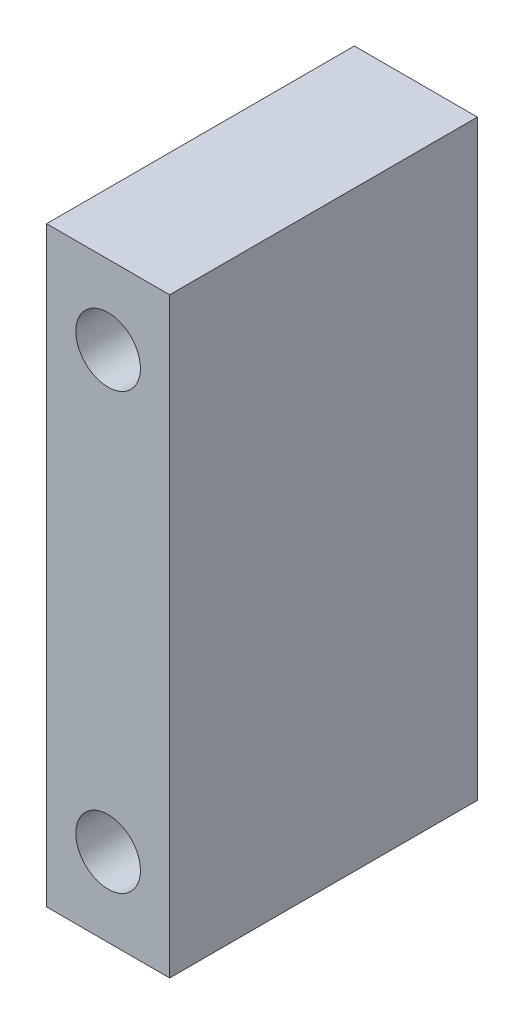
ISO-10303-21;
HEADER;
FILE_DESCRIPTION(('STEP AP214'),'2;1');
FILE_NAME('part.step','',(''),(''),'','','');
FILE_SCHEMA(('AUTOMOTIVE_DESIGN { 1 0 10303 214 1 1 1 1 }'));
ENDSEC;
DATA;
#1=APPLICATION_CONTEXT('core data for automotive mechanical design processes');
#2=APPLICATION_PROTOCOL_DEFINITION('international standard','automotive_design',2000,#1);
#3=PRODUCT_CONTEXT('',#1,'mechanical');
#4=PRODUCT('Part','Part','',(#3));
#5=PRODUCT_RELATED_PRODUCT_CATEGORY('part','',(#4));
#6=PRODUCT_DEFINITION_FORMATION('','',#4);
#7=PRODUCT_DEFINITION_CONTEXT('part definition',#1,'design');
#8=PRODUCT_DEFINITION('design','',#6,#7);
#9=PRODUCT_DEFINITION_SHAPE('','',#8);
#10=(LENGTH_UNIT() NAMED_UNIT(*) SI_UNIT(.MILLI.,.METRE.));
#11=(NAMED_UNIT(*) PLANE_ANGLE_UNIT() SI_UNIT($,.RADIAN.));
#12=(NAMED_UNIT(*) SI_UNIT($,.STERADIAN.) SOLID_ANGLE_UNIT());
#13=UNCERTAINTY_MEASURE_WITH_UNIT(LENGTH_MEASURE(1.E-05),#10,'distance_accuracy_value','');
#14=(GEOMETRIC_REPRESENTATION_CONTEXT(3) GLOBAL_UNCERTAINTY_ASSIGNED_CONTEXT((#13)) GLOBAL_UNIT_ASSIGNED_CONTEXT((#10,
#11,#12)) REPRESENTATION_CONTEXT('',''));
#15=CARTESIAN_POINT('',(0.,0.,0.));
#16=DIRECTION('',(0.,0.,1.));
#17=DIRECTION('',(1.,0.,0.));
#18=AXIS2_PLACEMENT_3D('',#15,#16,#17);
#19=CARTESIAN_POINT('',(0.,0.,20.));
#20=DIRECTION('',(0.,0.,1.));
#21=DIRECTION('',(1.,0.,0.));
#22=AXIS2_PLACEMENT_3D('',#19,#20,#21);
#23=PLANE('',#22);
#24=CARTESIAN_POINT('',(-4.,33.35,20.));
#25=DIRECTION('',(0.,0.,1.));
#26=DIRECTION('',(1.,0.,0.));
#27=AXIS2_PLACEMENT_3D('',#24,#25,#26);
#28=CIRCLE('',#27,2.1);
#29=CARTESIAN_POINT('',(-1.9,33.35,20.));
#30=VERTEX_POINT('',#29);
#31=EDGE_CURVE('E101',#30,#30,#28,.T.);
#32=ORIENTED_EDGE('',*,*,#31,.F.);
#33=EDGE_LOOP('',(#32));
#34=FACE_BOUND('',#33,.T.);
#35=DIRECTION('',(0.,-1.,0.));
#36=VECTOR('',#35,1.);
#37=CARTESIAN_POINT('',(-8.,38.45,20.));
#38=LINE('',#37,#36);
#39=CARTESIAN_POINT('',(-8.,38.45,20.));
#40=VERTEX_POINT('',#39);
#41=CARTESIAN_POINT('',(-8.,0.,20.));
#42=VERTEX_POINT('',#41);
#43=EDGE_CURVE('E86',#40,#42,#38,.T.);
#44=ORIENTED_EDGE('',*,*,#43,.T.);
#45=DIRECTION('',(1.,0.,0.));
#46=VECTOR('',#45,1.);
#47=CARTESIAN_POINT('',(-8.,0.,20.));
#48=LINE('',#47,#46);
#49=CARTESIAN_POINT('',(0.,0.,20.));
#50=VERTEX_POINT('',#49);
#51=EDGE_CURVE('E81',#42,#50,#48,.T.);
#52=ORIENTED_EDGE('',*,*,#51,.T.);
#53=DIRECTION('',(0.,1.,0.));
#54=VECTOR('',#53,1.);
#55=CARTESIAN_POINT('',(0.,38.45,20.));
#56=LINE('',#55,#54);
#57=CARTESIAN_POINT('',(0.,38.45,20.));
#58=VERTEX_POINT('',#57);
#59=EDGE_CURVE('E84',#50,#58,#56,.T.);
#60=ORIENTED_EDGE('',*,*,#59,.T.);
#61=DIRECTION('',(-1.,0.,0.));
#62=VECTOR('',#61,1.);
#63=CARTESIAN_POINT('',(-8.,38.45,20.));
#64=LINE('',#63,#62);
#65=EDGE_CURVE('E51',#58,#40,#64,.T.);
#66=ORIENTED_EDGE('',*,*,#65,.T.);
#67=EDGE_LOOP('',(#44,#52,#60,#66));
#68=FACE_BOUND('',#67,.T.);
#69=CARTESIAN_POINT('',(-4.,5.1,20.));
#70=DIRECTION('',(0.,0.,1.));
#71=DIRECTION('',(1.,0.,0.));
#72=AXIS2_PLACEMENT_3D('',#69,#70,#71);
#73=CIRCLE('',#72,2.1);
#74=CARTESIAN_POINT('',(-1.9,5.1,20.));
#75=VERTEX_POINT('',#74);
#76=EDGE_CURVE('E116',#75,#75,#73,.T.);
#77=ORIENTED_EDGE('',*,*,#76,.F.);
#78=EDGE_LOOP('',(#77));
#79=FACE_BOUND('',#78,.T.);
#80=ADVANCED_FACE('F34',(#34,#68,#79),#23,.T.);
#81=CARTESIAN_POINT('',(0.,0.,0.));
#82=DIRECTION('',(0.,0.,1.));
#83=DIRECTION('',(1.,0.,0.));
#84=AXIS2_PLACEMENT_3D('',#81,#82,#83);
#85=PLANE('',#84);
#86=DIRECTION('',(0.,-1.,0.));
#87=VECTOR('',#86,1.);
#88=CARTESIAN_POINT('',(-8.,38.45,0.));
#89=LINE('',#88,#87);
#90=CARTESIAN_POINT('',(-8.,38.45,0.));
#91=VERTEX_POINT('',#90);
#92=CARTESIAN_POINT('',(-8.,0.,0.));
#93=VERTEX_POINT('',#92);
#94=EDGE_CURVE('E98',#91,#93,#89,.T.);
#95=ORIENTED_EDGE('',*,*,#94,.F.);
#96=DIRECTION('',(-1.,0.,0.));
#97=VECTOR('',#96,1.);
#98=CARTESIAN_POINT('',(-8.,38.45,0.));
#99=LINE('',#98,#97);
#100=CARTESIAN_POINT('',(0.,38.45,0.));
#101=VERTEX_POINT('',#100);
#102=EDGE_CURVE('E74',#101,#91,#99,.T.);
#103=ORIENTED_EDGE('',*,*,#102,.F.);
#104=DIRECTION('',(0.,1.,0.));
#105=VECTOR('',#104,1.);
#106=CARTESIAN_POINT('',(0.,38.45,0.));
#107=LINE('',#106,#105);
#108=CARTESIAN_POINT('',(0.,0.,0.));
#109=VERTEX_POINT('',#108);
#110=EDGE_CURVE('E68',#109,#101,#107,.T.);
#111=ORIENTED_EDGE('',*,*,#110,.F.);
#112=DIRECTION('',(1.,0.,0.));
#113=VECTOR('',#112,1.);
#114=CARTESIAN_POINT('',(-8.,0.,0.));
#115=LINE('',#114,#113);
#116=EDGE_CURVE('E90',#93,#109,#115,.T.);
#117=ORIENTED_EDGE('',*,*,#116,.F.);
#118=EDGE_LOOP('',(#95,#103,#111,#117));
#119=FACE_BOUND('',#118,.T.);
#120=CARTESIAN_POINT('',(-4.,33.35,0.));
#121=DIRECTION('',(0.,0.,1.));
#122=DIRECTION('',(1.,0.,0.));
#123=AXIS2_PLACEMENT_3D('',#120,#121,#122);
#124=CIRCLE('',#123,2.1);
#125=CARTESIAN_POINT('',(-1.9,33.35,0.));
#126=VERTEX_POINT('',#125);
#127=EDGE_CURVE('E113',#126,#126,#124,.T.);
#128=ORIENTED_EDGE('',*,*,#127,.T.);
#129=EDGE_LOOP('',(#128));
#130=FACE_BOUND('',#129,.T.);
#131=CARTESIAN_POINT('',(-4.,5.1,0.));
#132=DIRECTION('',(0.,0.,1.));
#133=DIRECTION('',(1.,0.,0.));
#134=AXIS2_PLACEMENT_3D('',#131,#132,#133);
#135=CIRCLE('',#134,2.1);
#136=CARTESIAN_POINT('',(-1.9,5.1,0.));
#137=VERTEX_POINT('',#136);
#138=EDGE_CURVE('E119',#137,#137,#135,.T.);
#139=ORIENTED_EDGE('',*,*,#138,.T.);
#140=EDGE_LOOP('',(#139));
#141=FACE_BOUND('',#140,.T.);
#142=ADVANCED_FACE('F109',(#119,#130,#141),#85,.F.);
#143=CARTESIAN_POINT('',(-8.,38.45,20.));
#144=DIRECTION('',(1.,0.,0.));
#145=DIRECTION('',(0.,1.,0.));
#146=AXIS2_PLACEMENT_3D('',#143,#144,#145);
#147=PLANE('',#146);
#148=ORIENTED_EDGE('',*,*,#94,.T.);
#149=DIRECTION('',(0.,0.,-1.));
#150=VECTOR('',#149,1.);
#151=CARTESIAN_POINT('',(-8.,0.,20.));
#152=LINE('',#151,#150);
#153=EDGE_CURVE('E11',#42,#93,#152,.T.);
#154=ORIENTED_EDGE('',*,*,#153,.F.);
#155=ORIENTED_EDGE('',*,*,#43,.F.);
#156=DIRECTION('',(0.,0.,-1.));
#157=VECTOR('',#156,1.);
#158=CARTESIAN_POINT('',(-8.,38.45,20.));
#159=LINE('',#158,#157);
#160=EDGE_CURVE('E94',#40,#91,#159,.T.);
#161=ORIENTED_EDGE('',*,*,#160,.T.);
#162=EDGE_LOOP('',(#148,#154,#155,#161));
#163=FACE_BOUND('',#162,.T.);
#164=ADVANCED_FACE('F36',(#163),#147,.F.);
#165=CARTESIAN_POINT('',(-8.,0.,20.));
#166=DIRECTION('',(0.,1.,0.));
#167=DIRECTION('',(0.,0.,1.));
#168=AXIS2_PLACEMENT_3D('',#165,#166,#167);
#169=PLANE('',#168);
#170=ORIENTED_EDGE('',*,*,#116,.T.);
#171=DIRECTION('',(0.,0.,-1.));
#172=VECTOR('',#171,1.);
#173=CARTESIAN_POINT('',(0.,0.,20.));
#174=LINE('',#173,#172);
#175=EDGE_CURVE('E43',#50,#109,#174,.T.);
#176=ORIENTED_EDGE('',*,*,#175,.F.);
#177=ORIENTED_EDGE('',*,*,#51,.F.);
#178=ORIENTED_EDGE('',*,*,#153,.T.);
#179=EDGE_LOOP('',(#170,#176,#177,#178));
#180=FACE_BOUND('',#179,.T.);
#181=ADVANCED_FACE('F89',(#180),#169,.F.);
#182=CARTESIAN_POINT('',(0.,38.45,20.));
#183=DIRECTION('',(-1.,0.,0.));
#184=DIRECTION('',(0.,0.,1.));
#185=AXIS2_PLACEMENT_3D('',#182,#183,#184);
#186=PLANE('',#185);
#187=ORIENTED_EDGE('',*,*,#110,.T.);
#188=DIRECTION('',(0.,0.,-1.));
#189=VECTOR('',#188,1.);
#190=CARTESIAN_POINT('',(0.,38.45,20.));
#191=LINE('',#190,#189);
#192=EDGE_CURVE('E91',#58,#101,#191,.T.);
#193=ORIENTED_EDGE('',*,*,#192,.F.);
#194=ORIENTED_EDGE('',*,*,#59,.F.);
#195=ORIENTED_EDGE('',*,*,#175,.T.);
#196=EDGE_LOOP('',(#187,#193,#194,#195));
#197=FACE_BOUND('',#196,.T.);
#198=ADVANCED_FACE('F92',(#197),#186,.F.);
#199=CARTESIAN_POINT('',(-8.,38.45,20.));
#200=DIRECTION('',(0.,-1.,0.));
#201=DIRECTION('',(0.,0.,-1.));
#202=AXIS2_PLACEMENT_3D('',#199,#200,#201);
#203=PLANE('',#202);
#204=ORIENTED_EDGE('',*,*,#102,.T.);
#205=ORIENTED_EDGE('',*,*,#160,.F.);
#206=ORIENTED_EDGE('',*,*,#65,.F.);
#207=ORIENTED_EDGE('',*,*,#192,.T.);
#208=EDGE_LOOP('',(#204,#205,#206,#207));
#209=FACE_BOUND('',#208,.T.);
#210=ADVANCED_FACE('F106',(#209),#203,.F.);
#211=CARTESIAN_POINT('',(-4.,33.35,20.));
#212=DIRECTION('',(0.,0.,-1.));
#213=DIRECTION('',(-1.,0.,0.));
#214=AXIS2_PLACEMENT_3D('',#211,#212,#213);
#215=CYLINDRICAL_SURFACE('',#214,2.1);
#216=ORIENTED_EDGE('',*,*,#31,.T.);
#217=EDGE_LOOP('',(#216));
#218=FACE_BOUND('',#217,.T.);
#219=ORIENTED_EDGE('',*,*,#127,.F.);
#220=EDGE_LOOP('',(#219));
#221=FACE_BOUND('',#220,.T.);
#222=ADVANCED_FACE('F136',(#218,#221),#215,.F.);
#223=CARTESIAN_POINT('',(-4.,5.1,20.));
#224=DIRECTION('',(0.,0.,-1.));
#225=DIRECTION('',(-1.,0.,0.));
#226=AXIS2_PLACEMENT_3D('',#223,#224,#225);
#227=CYLINDRICAL_SURFACE('',#226,2.1);
#228=ORIENTED_EDGE('',*,*,#76,.T.);
#229=EDGE_LOOP('',(#228));
#230=FACE_BOUND('',#229,.T.);
#231=ORIENTED_EDGE('',*,*,#138,.F.);
#232=EDGE_LOOP('',(#231));
#233=FACE_BOUND('',#232,.T.);
#234=ADVANCED_FACE('F125',(#230,#233),#227,.F.);
#235=CLOSED_SHELL('',(#80,#142,#164,#181,#198,#210,#222,#234));
#236=MANIFOLD_SOLID_BREP('B2',#235);
#237=ADVANCED_BREP_SHAPE_REPRESENTATION('',(#18,#236),#14);
#238=SHAPE_DEFINITION_REPRESENTATION(#9,#237);
ENDSEC;
END-ISO-10303-21;
